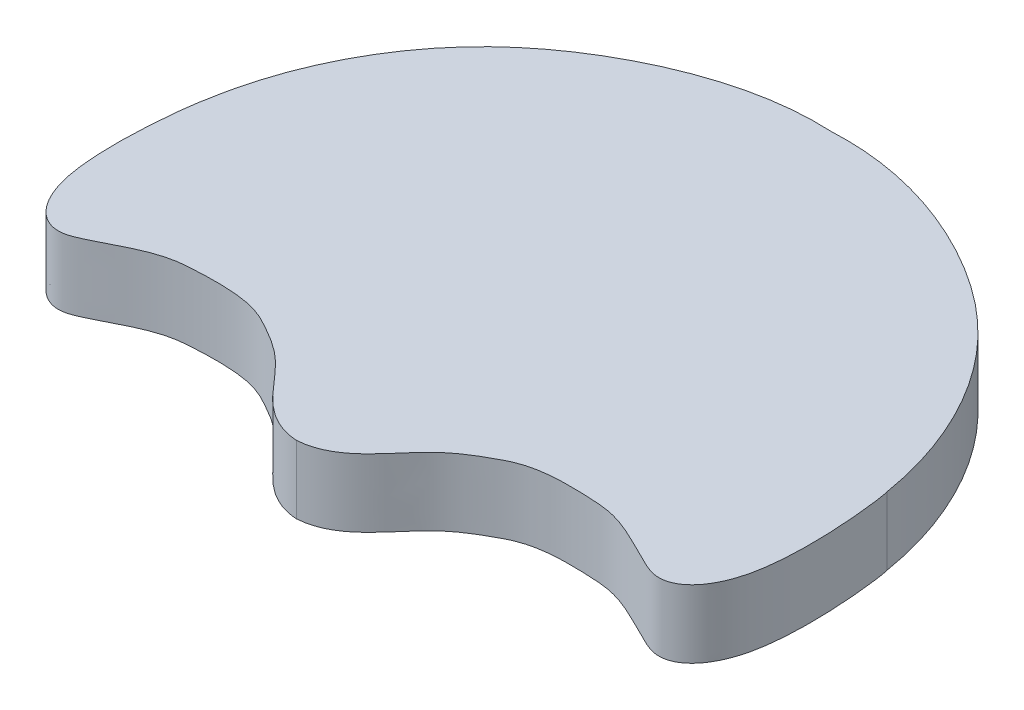
ISO-10303-21;
HEADER;
FILE_DESCRIPTION(('STEP AP214'),'2;1');
FILE_NAME('part.step','',(''),(''),'','','');
FILE_SCHEMA(('AUTOMOTIVE_DESIGN { 1 0 10303 214 1 1 1 1 }'));
ENDSEC;
DATA;
#1=APPLICATION_CONTEXT('core data for automotive mechanical design processes');
#2=APPLICATION_PROTOCOL_DEFINITION('international standard','automotive_design',2000,#1);
#3=PRODUCT_CONTEXT('',#1,'mechanical');
#4=PRODUCT('Part','Part','',(#3));
#5=PRODUCT_RELATED_PRODUCT_CATEGORY('part','',(#4));
#6=PRODUCT_DEFINITION_FORMATION('','',#4);
#7=PRODUCT_DEFINITION_CONTEXT('part definition',#1,'design');
#8=PRODUCT_DEFINITION('design','',#6,#7);
#9=PRODUCT_DEFINITION_SHAPE('','',#8);
#10=(LENGTH_UNIT() NAMED_UNIT(*) SI_UNIT(.MILLI.,.METRE.));
#11=(NAMED_UNIT(*) PLANE_ANGLE_UNIT() SI_UNIT($,.RADIAN.));
#12=(NAMED_UNIT(*) SI_UNIT($,.STERADIAN.) SOLID_ANGLE_UNIT());
#13=UNCERTAINTY_MEASURE_WITH_UNIT(LENGTH_MEASURE(1.E-05),#10,'distance_accuracy_value','');
#14=(GEOMETRIC_REPRESENTATION_CONTEXT(3) GLOBAL_UNCERTAINTY_ASSIGNED_CONTEXT((#13)) GLOBAL_UNIT_ASSIGNED_CONTEXT((#10,
#11,#12)) REPRESENTATION_CONTEXT('',''));
#15=CARTESIAN_POINT('',(0.,0.,0.));
#16=DIRECTION('',(0.,0.,1.));
#17=DIRECTION('',(1.,0.,0.));
#18=AXIS2_PLACEMENT_3D('',#15,#16,#17);
#19=CARTESIAN_POINT('',(-190.5,38.1,0.));
#20=CARTESIAN_POINT('',(-192.064011792662,38.1,4.96350192621509));
#21=CARTESIAN_POINT('',(-201.967167765924,38.1,83.3146183109833));
#22=CARTESIAN_POINT('',(-174.696602041029,38.1,109.289958804391));
#23=CARTESIAN_POINT('',(-151.630121659032,38.1,100.567984898405));
#24=CARTESIAN_POINT('',(-131.410771519055,38.1,87.7197839609674));
#25=CARTESIAN_POINT('',(-96.8435676275136,38.1,85.3754033772216));
#26=CARTESIAN_POINT('',(-78.6925101438482,38.1,86.2588274201763));
#27=CARTESIAN_POINT('',(-58.8335330715194,38.1,96.8793824699203));
#28=CARTESIAN_POINT('',(-37.3059346099107,38.1,109.935798161985));
#29=CARTESIAN_POINT('',(-21.3496139460233,38.1,139.114767456721));
#30=CARTESIAN_POINT('',(1.40754784340045E-13,38.1,140.530090072389));
#31=B_SPLINE_CURVE_WITH_KNOTS('',3,(#19,#20,#21,#22,#23,#24,#25,#26,#27,#28,#29,#30),
.UNSPECIFIED.,.F.,.F.,(4,1,1,1,1,1,1,1,1,4),(0.,0.166997051795611,0.292320514089622,
0.319633117373991,0.426735310498713,0.458914050276757,0.609241775376387,0.641909703937047,
0.766802370245909,1.),.UNSPECIFIED.);
#32=DIRECTION('',(0.,-1.,0.));
#33=VECTOR('',#32,1.);
#34=SURFACE_OF_LINEAR_EXTRUSION('',#31,#33);
#35=CARTESIAN_POINT('',(-190.5,0.,0.));
#36=CARTESIAN_POINT('',(-192.064011792662,0.,4.96350192621509));
#37=CARTESIAN_POINT('',(-201.967167765924,0.,83.3146183109833));
#38=CARTESIAN_POINT('',(-174.696602041029,0.,109.289958804391));
#39=CARTESIAN_POINT('',(-151.630121659032,0.,100.567984898405));
#40=CARTESIAN_POINT('',(-131.410771519055,0.,87.7197839609674));
#41=CARTESIAN_POINT('',(-96.8435676275136,0.,85.3754033772216));
#42=CARTESIAN_POINT('',(-78.6925101438482,0.,86.2588274201763));
#43=CARTESIAN_POINT('',(-58.8335330715194,0.,96.8793824699203));
#44=CARTESIAN_POINT('',(-37.3059346099107,0.,109.935798161985));
#45=CARTESIAN_POINT('',(-21.3496139460233,0.,139.114767456721));
#46=CARTESIAN_POINT('',(1.40754784340045E-13,0.,140.530090072389));
#47=B_SPLINE_CURVE_WITH_KNOTS('',3,(#35,#36,#37,#38,#39,#40,#41,#42,#43,#44,#45,#46),
.UNSPECIFIED.,.F.,.F.,(4,1,1,1,1,1,1,1,1,4),(0.,0.166997051795611,0.292320514089622,
0.319633117373991,0.426735310498713,0.458914050276757,0.609241775376387,0.641909703937047,
0.766802370245909,1.),.UNSPECIFIED.);
#48=CARTESIAN_POINT('',(-190.5,0.,0.));
#49=VERTEX_POINT('',#48);
#50=CARTESIAN_POINT('',(-1.06334839341837E-13,0.,140.530090072389));
#51=VERTEX_POINT('',#50);
#52=EDGE_CURVE('E134',#49,#51,#47,.T.);
#53=ORIENTED_EDGE('',*,*,#52,.T.);
#54=DIRECTION('',(0.,-1.,0.));
#55=VECTOR('',#54,1.);
#56=CARTESIAN_POINT('',(-1.06334839341837E-13,38.1,140.530090072389));
#57=LINE('',#56,#55);
#58=CARTESIAN_POINT('',(-1.06334839341837E-13,38.1,140.530090072389));
#59=VERTEX_POINT('',#58);
#60=EDGE_CURVE('E11',#59,#51,#57,.T.);
#61=ORIENTED_EDGE('',*,*,#60,.F.);
#62=CARTESIAN_POINT('',(-190.5,38.1,0.));
#63=VERTEX_POINT('',#62);
#64=EDGE_CURVE('E97',#63,#59,#31,.T.);
#65=ORIENTED_EDGE('',*,*,#64,.F.);
#66=DIRECTION('',(0.,-1.,0.));
#67=VECTOR('',#66,1.);
#68=CARTESIAN_POINT('',(-190.5,38.1,0.));
#69=LINE('',#68,#67);
#70=EDGE_CURVE('E105',#63,#49,#69,.T.);
#71=ORIENTED_EDGE('',*,*,#70,.T.);
#72=EDGE_LOOP('',(#53,#61,#65,#71));
#73=FACE_BOUND('',#72,.T.);
#74=ADVANCED_FACE('F45',(#73),#34,.F.);
#75=CARTESIAN_POINT('',(-1.06334839341837E-13,38.1,140.530090072389));
#76=CARTESIAN_POINT('',(21.3496139460233,38.1,139.114767456721));
#77=CARTESIAN_POINT('',(37.3059346099107,38.1,109.935798161984));
#78=CARTESIAN_POINT('',(58.8335330715195,38.1,96.8793824699203));
#79=CARTESIAN_POINT('',(78.6925101438482,38.1,86.2588274201763));
#80=CARTESIAN_POINT('',(96.8435676275136,38.1,85.3754033772216));
#81=CARTESIAN_POINT('',(131.410771519055,38.1,87.7197839609674));
#82=CARTESIAN_POINT('',(151.630121659032,38.1,100.567984898405));
#83=CARTESIAN_POINT('',(174.696602041029,38.1,109.289958804391));
#84=CARTESIAN_POINT('',(201.967167765924,38.1,83.3146183109832));
#85=CARTESIAN_POINT('',(192.064011792662,38.1,4.96350192621503));
#86=CARTESIAN_POINT('',(190.5,38.1,0.));
#87=B_SPLINE_CURVE_WITH_KNOTS('',3,(#75,#76,#77,#78,#79,#80,#81,#82,#83,#84,#85,#86),
.UNSPECIFIED.,.F.,.F.,(4,1,1,1,1,1,1,1,1,4),(0.,0.233197629754091,0.358090296062953,
0.390758224623613,0.541085949723243,0.573264689501287,0.680366882626009,0.707679485910378,
0.833002948204389,1.),.UNSPECIFIED.);
#88=DIRECTION('',(0.,-1.,0.));
#89=VECTOR('',#88,1.);
#90=SURFACE_OF_LINEAR_EXTRUSION('',#87,#89);
#91=CARTESIAN_POINT('',(-1.06334839341837E-13,0.,140.530090072389));
#92=CARTESIAN_POINT('',(21.3496139460233,0.,139.114767456721));
#93=CARTESIAN_POINT('',(37.3059346099107,0.,109.935798161984));
#94=CARTESIAN_POINT('',(58.8335330715195,0.,96.8793824699203));
#95=CARTESIAN_POINT('',(78.6925101438482,0.,86.2588274201763));
#96=CARTESIAN_POINT('',(96.8435676275136,0.,85.3754033772216));
#97=CARTESIAN_POINT('',(131.410771519055,0.,87.7197839609674));
#98=CARTESIAN_POINT('',(151.630121659032,0.,100.567984898405));
#99=CARTESIAN_POINT('',(174.696602041029,0.,109.289958804391));
#100=CARTESIAN_POINT('',(201.967167765924,0.,83.3146183109832));
#101=CARTESIAN_POINT('',(192.064011792662,0.,4.96350192621503));
#102=CARTESIAN_POINT('',(190.5,0.,0.));
#103=B_SPLINE_CURVE_WITH_KNOTS('',3,(#91,#92,#93,#94,#95,#96,#97,#98,#99,#100,#101,#102),
.UNSPECIFIED.,.F.,.F.,(4,1,1,1,1,1,1,1,1,4),(0.,0.233197629754091,0.358090296062953,
0.390758224623613,0.541085949723243,0.573264689501287,0.680366882626009,0.707679485910378,
0.833002948204389,1.),.UNSPECIFIED.);
#104=CARTESIAN_POINT('',(190.5,0.,0.));
#105=VERTEX_POINT('',#104);
#106=EDGE_CURVE('E101',#51,#105,#103,.T.);
#107=ORIENTED_EDGE('',*,*,#106,.T.);
#108=DIRECTION('',(0.,-1.,0.));
#109=VECTOR('',#108,1.);
#110=CARTESIAN_POINT('',(190.5,38.1,0.));
#111=LINE('',#110,#109);
#112=CARTESIAN_POINT('',(190.5,38.1,0.));
#113=VERTEX_POINT('',#112);
#114=EDGE_CURVE('E54',#113,#105,#111,.T.);
#115=ORIENTED_EDGE('',*,*,#114,.F.);
#116=EDGE_CURVE('E92',#59,#113,#87,.T.);
#117=ORIENTED_EDGE('',*,*,#116,.F.);
#118=ORIENTED_EDGE('',*,*,#60,.T.);
#119=EDGE_LOOP('',(#107,#115,#117,#118));
#120=FACE_BOUND('',#119,.T.);
#121=ADVANCED_FACE('F100',(#120),#90,.F.);
#122=CARTESIAN_POINT('',(190.5,38.1,0.));
#123=CARTESIAN_POINT('',(184.392726562295,38.1,-37.5370382365467));
#124=CARTESIAN_POINT('',(157.261289846749,38.1,-93.9640934852783));
#125=CARTESIAN_POINT('',(82.3874782016624,38.1,-146.622658841393));
#126=CARTESIAN_POINT('',(31.3113741429568,38.1,-160.799884185231));
#127=CARTESIAN_POINT('',(0.,38.1,-159.189909927611));
#128=B_SPLINE_CURVE_WITH_KNOTS('',3,(#122,#123,#124,#125,#126,#127),.UNSPECIFIED.,.F.,.F.,(4,1,
1,4),(0.,0.424401365551712,0.65636958095173,1.),.UNSPECIFIED.);
#129=DIRECTION('',(0.,-1.,0.));
#130=VECTOR('',#129,1.);
#131=SURFACE_OF_LINEAR_EXTRUSION('',#128,#130);
#132=CARTESIAN_POINT('',(190.5,0.,0.));
#133=CARTESIAN_POINT('',(184.392726562295,0.,-37.5370382365467));
#134=CARTESIAN_POINT('',(157.261289846749,0.,-93.9640934852783));
#135=CARTESIAN_POINT('',(82.3874782016624,0.,-146.622658841393));
#136=CARTESIAN_POINT('',(31.3113741429568,0.,-160.799884185231));
#137=CARTESIAN_POINT('',(0.,0.,-159.189909927611));
#138=B_SPLINE_CURVE_WITH_KNOTS('',3,(#132,#133,#134,#135,#136,#137),.UNSPECIFIED.,.F.,.F.,(4,1,
1,4),(0.,0.424401365551712,0.65636958095173,1.),.UNSPECIFIED.);
#139=CARTESIAN_POINT('',(0.,0.,-159.189909927611));
#140=VERTEX_POINT('',#139);
#141=EDGE_CURVE('E79',#105,#140,#138,.T.);
#142=ORIENTED_EDGE('',*,*,#141,.T.);
#143=DIRECTION('',(0.,-1.,0.));
#144=VECTOR('',#143,1.);
#145=CARTESIAN_POINT('',(0.,38.1,-159.189909927611));
#146=LINE('',#145,#144);
#147=CARTESIAN_POINT('',(0.,38.1,-159.189909927611));
#148=VERTEX_POINT('',#147);
#149=EDGE_CURVE('E102',#148,#140,#146,.T.);
#150=ORIENTED_EDGE('',*,*,#149,.F.);
#151=EDGE_CURVE('E95',#113,#148,#128,.T.);
#152=ORIENTED_EDGE('',*,*,#151,.F.);
#153=ORIENTED_EDGE('',*,*,#114,.T.);
#154=EDGE_LOOP('',(#142,#150,#152,#153));
#155=FACE_BOUND('',#154,.T.);
#156=ADVANCED_FACE('F103',(#155),#131,.F.);
#157=CARTESIAN_POINT('',(0.,38.1,-159.189909927611));
#158=CARTESIAN_POINT('',(-31.3113741429568,38.1,-160.799884185231));
#159=CARTESIAN_POINT('',(-82.3874782016624,38.1,-146.622658841393));
#160=CARTESIAN_POINT('',(-157.261289846749,38.1,-93.9640934852783));
#161=CARTESIAN_POINT('',(-184.392726562295,38.1,-37.5370382365467));
#162=CARTESIAN_POINT('',(-190.5,38.1,0.));
#163=B_SPLINE_CURVE_WITH_KNOTS('',3,(#157,#158,#159,#160,#161,#162),.UNSPECIFIED.,.F.,.F.,(4,1,
1,4),(0.,0.34363041904827,0.575598634448288,1.),.UNSPECIFIED.);
#164=DIRECTION('',(0.,-1.,0.));
#165=VECTOR('',#164,1.);
#166=SURFACE_OF_LINEAR_EXTRUSION('',#163,#165);
#167=CARTESIAN_POINT('',(0.,0.,-159.189909927611));
#168=CARTESIAN_POINT('',(-31.3113741429568,0.,-160.799884185231));
#169=CARTESIAN_POINT('',(-82.3874782016624,0.,-146.622658841393));
#170=CARTESIAN_POINT('',(-157.261289846749,0.,-93.9640934852783));
#171=CARTESIAN_POINT('',(-184.392726562295,0.,-37.5370382365467));
#172=CARTESIAN_POINT('',(-190.5,0.,0.));
#173=B_SPLINE_CURVE_WITH_KNOTS('',3,(#167,#168,#169,#170,#171,#172),.UNSPECIFIED.,.F.,.F.,(4,1,
1,4),(0.,0.34363041904827,0.575598634448288,1.),.UNSPECIFIED.);
#174=EDGE_CURVE('E85',#140,#49,#173,.T.);
#175=ORIENTED_EDGE('',*,*,#174,.T.);
#176=ORIENTED_EDGE('',*,*,#70,.F.);
#177=EDGE_CURVE('E62',#148,#63,#163,.T.);
#178=ORIENTED_EDGE('',*,*,#177,.F.);
#179=ORIENTED_EDGE('',*,*,#149,.T.);
#180=EDGE_LOOP('',(#175,#176,#178,#179));
#181=FACE_BOUND('',#180,.T.);
#182=ADVANCED_FACE('F123',(#181),#166,.F.);
#183=CARTESIAN_POINT('',(-98.1259130559372,38.1,86.0527308590208));
#184=DIRECTION('',(0.,-1.,0.));
#185=DIRECTION('',(0.,0.,-1.));
#186=AXIS2_PLACEMENT_3D('',#183,#184,#185);
#187=PLANE('',#186);
#188=ORIENTED_EDGE('',*,*,#64,.T.);
#189=ORIENTED_EDGE('',*,*,#116,.T.);
#190=ORIENTED_EDGE('',*,*,#151,.T.);
#191=ORIENTED_EDGE('',*,*,#177,.T.);
#192=EDGE_LOOP('',(#188,#189,#190,#191));
#193=FACE_BOUND('',#192,.T.);
#194=ADVANCED_FACE('F93',(#193),#187,.F.);
#195=CARTESIAN_POINT('',(-98.1259130559372,0.,86.0527308590208));
#196=DIRECTION('',(0.,-1.,0.));
#197=DIRECTION('',(0.,0.,-1.));
#198=AXIS2_PLACEMENT_3D('',#195,#196,#197);
#199=PLANE('',#198);
#200=ORIENTED_EDGE('',*,*,#52,.F.);
#201=ORIENTED_EDGE('',*,*,#174,.F.);
#202=ORIENTED_EDGE('',*,*,#141,.F.);
#203=ORIENTED_EDGE('',*,*,#106,.F.);
#204=EDGE_LOOP('',(#200,#201,#202,#203));
#205=FACE_BOUND('',#204,.T.);
#206=ADVANCED_FACE('F161',(#205),#199,.T.);
#207=CLOSED_SHELL('',(#74,#121,#156,#182,#194,#206));
#208=MANIFOLD_SOLID_BREP('B2',#207);
#209=ADVANCED_BREP_SHAPE_REPRESENTATION('',(#18,#208),#14);
#210=SHAPE_DEFINITION_REPRESENTATION(#9,#209);
ENDSEC;
END-ISO-10303-21;
